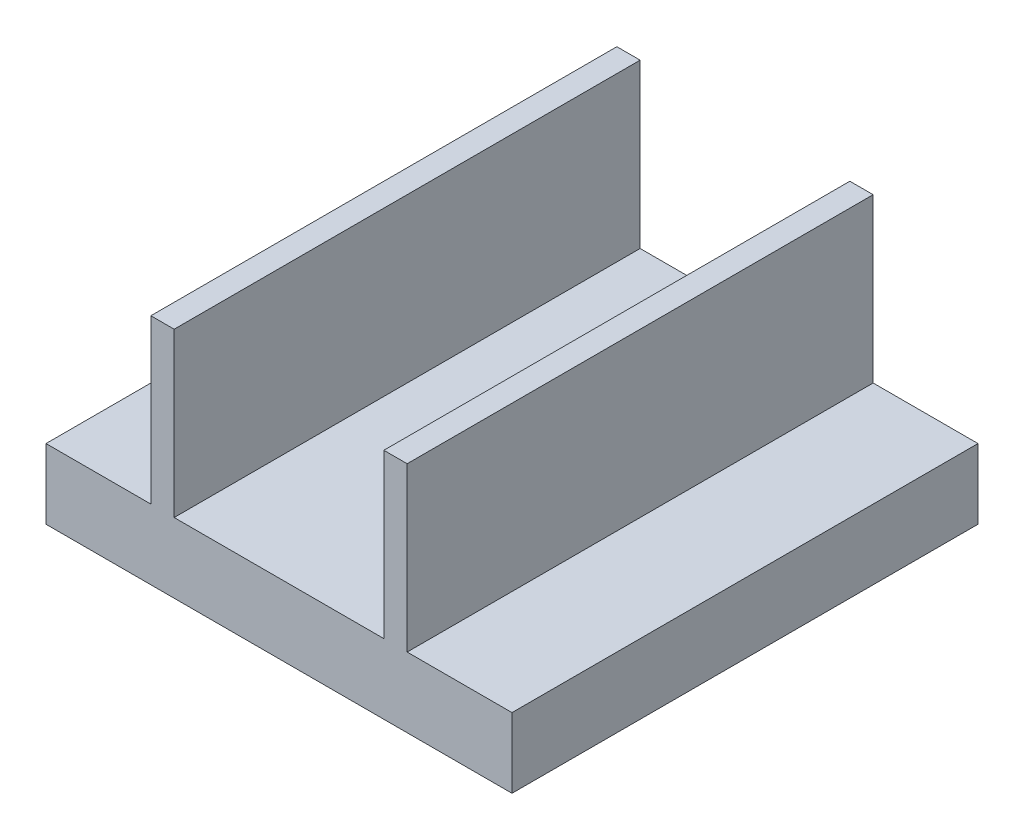
ISO-10303-21;
HEADER;
FILE_DESCRIPTION(('STEP AP214'),'2;1');
FILE_NAME('part.step','',(''),(''),'','','');
FILE_SCHEMA(('AUTOMOTIVE_DESIGN { 1 0 10303 214 1 1 1 1 }'));
ENDSEC;
DATA;
#1=APPLICATION_CONTEXT('core data for automotive mechanical design processes');
#2=APPLICATION_PROTOCOL_DEFINITION('international standard','automotive_design',2000,#1);
#3=PRODUCT_CONTEXT('',#1,'mechanical');
#4=PRODUCT('Part','Part','',(#3));
#5=PRODUCT_RELATED_PRODUCT_CATEGORY('part','',(#4));
#6=PRODUCT_DEFINITION_FORMATION('','',#4);
#7=PRODUCT_DEFINITION_CONTEXT('part definition',#1,'design');
#8=PRODUCT_DEFINITION('design','',#6,#7);
#9=PRODUCT_DEFINITION_SHAPE('','',#8);
#10=(LENGTH_UNIT() NAMED_UNIT(*) SI_UNIT(.MILLI.,.METRE.));
#11=(NAMED_UNIT(*) PLANE_ANGLE_UNIT() SI_UNIT($,.RADIAN.));
#12=(NAMED_UNIT(*) SI_UNIT($,.STERADIAN.) SOLID_ANGLE_UNIT());
#13=UNCERTAINTY_MEASURE_WITH_UNIT(LENGTH_MEASURE(1.E-05),#10,'distance_accuracy_value','');
#14=(GEOMETRIC_REPRESENTATION_CONTEXT(3) GLOBAL_UNCERTAINTY_ASSIGNED_CONTEXT((#13)) GLOBAL_UNIT_ASSIGNED_CONTEXT((#10,
#11,#12)) REPRESENTATION_CONTEXT('',''));
#15=CARTESIAN_POINT('',(0.,0.,0.));
#16=DIRECTION('',(0.,0.,1.));
#17=DIRECTION('',(1.,0.,0.));
#18=AXIS2_PLACEMENT_3D('',#15,#16,#17);
#19=CARTESIAN_POINT('',(0.,0.,20.));
#20=DIRECTION('',(1.,0.,0.));
#21=DIRECTION('',(0.,0.,-1.));
#22=AXIS2_PLACEMENT_3D('',#19,#20,#21);
#23=PLANE('',#22);
#24=DIRECTION('',(0.,-1.,0.));
#25=VECTOR('',#24,1.);
#26=CARTESIAN_POINT('',(0.,0.,0.));
#27=LINE('',#26,#25);
#28=CARTESIAN_POINT('',(0.,3.,0.));
#29=VERTEX_POINT('',#28);
#30=CARTESIAN_POINT('',(0.,0.,0.));
#31=VERTEX_POINT('',#30);
#32=EDGE_CURVE('E163',#29,#31,#27,.T.);
#33=ORIENTED_EDGE('',*,*,#32,.T.);
#34=DIRECTION('',(0.,0.,-1.));
#35=VECTOR('',#34,1.);
#36=CARTESIAN_POINT('',(0.,0.,20.));
#37=LINE('',#36,#35);
#38=CARTESIAN_POINT('',(0.,0.,20.));
#39=VERTEX_POINT('',#38);
#40=EDGE_CURVE('E11',#39,#31,#37,.T.);
#41=ORIENTED_EDGE('',*,*,#40,.F.);
#42=DIRECTION('',(0.,-1.,0.));
#43=VECTOR('',#42,1.);
#44=CARTESIAN_POINT('',(0.,0.,20.));
#45=LINE('',#44,#43);
#46=CARTESIAN_POINT('',(0.,3.,20.));
#47=VERTEX_POINT('',#46);
#48=EDGE_CURVE('E185',#47,#39,#45,.T.);
#49=ORIENTED_EDGE('',*,*,#48,.F.);
#50=DIRECTION('',(0.,0.,-1.));
#51=VECTOR('',#50,1.);
#52=CARTESIAN_POINT('',(0.,3.,20.));
#53=LINE('',#52,#51);
#54=EDGE_CURVE('E159',#47,#29,#53,.T.);
#55=ORIENTED_EDGE('',*,*,#54,.T.);
#56=EDGE_LOOP('',(#33,#41,#49,#55));
#57=FACE_BOUND('',#56,.T.);
#58=ADVANCED_FACE('F43',(#57),#23,.F.);
#59=CARTESIAN_POINT('',(0.,0.,20.));
#60=DIRECTION('',(0.,1.,0.));
#61=DIRECTION('',(0.,0.,1.));
#62=AXIS2_PLACEMENT_3D('',#59,#60,#61);
#63=PLANE('',#62);
#64=DIRECTION('',(1.,0.,0.));
#65=VECTOR('',#64,1.);
#66=CARTESIAN_POINT('',(0.,0.,0.));
#67=LINE('',#66,#65);
#68=CARTESIAN_POINT('',(20.,0.,0.));
#69=VERTEX_POINT('',#68);
#70=EDGE_CURVE('E166',#31,#69,#67,.T.);
#71=ORIENTED_EDGE('',*,*,#70,.T.);
#72=DIRECTION('',(0.,0.,-1.));
#73=VECTOR('',#72,1.);
#74=CARTESIAN_POINT('',(20.,0.,20.));
#75=LINE('',#74,#73);
#76=CARTESIAN_POINT('',(20.,0.,20.));
#77=VERTEX_POINT('',#76);
#78=EDGE_CURVE('E51',#77,#69,#75,.T.);
#79=ORIENTED_EDGE('',*,*,#78,.F.);
#80=DIRECTION('',(1.,0.,0.));
#81=VECTOR('',#80,1.);
#82=CARTESIAN_POINT('',(0.,0.,20.));
#83=LINE('',#82,#81);
#84=EDGE_CURVE('E114',#39,#77,#83,.T.);
#85=ORIENTED_EDGE('',*,*,#84,.F.);
#86=ORIENTED_EDGE('',*,*,#40,.T.);
#87=EDGE_LOOP('',(#71,#79,#85,#86));
#88=FACE_BOUND('',#87,.T.);
#89=ADVANCED_FACE('F263',(#88),#63,.F.);
#90=CARTESIAN_POINT('',(20.,0.,20.));
#91=DIRECTION('',(-1.,0.,0.));
#92=DIRECTION('',(0.,0.,1.));
#93=AXIS2_PLACEMENT_3D('',#90,#91,#92);
#94=PLANE('',#93);
#95=DIRECTION('',(0.,1.,0.));
#96=VECTOR('',#95,1.);
#97=CARTESIAN_POINT('',(20.,0.,0.));
#98=LINE('',#97,#96);
#99=CARTESIAN_POINT('',(20.,3.,0.));
#100=VERTEX_POINT('',#99);
#101=EDGE_CURVE('E168',#69,#100,#98,.T.);
#102=ORIENTED_EDGE('',*,*,#101,.T.);
#103=DIRECTION('',(0.,0.,-1.));
#104=VECTOR('',#103,1.);
#105=CARTESIAN_POINT('',(20.,3.,20.));
#106=LINE('',#105,#104);
#107=CARTESIAN_POINT('',(20.,3.,20.));
#108=VERTEX_POINT('',#107);
#109=EDGE_CURVE('E204',#108,#100,#106,.T.);
#110=ORIENTED_EDGE('',*,*,#109,.F.);
#111=DIRECTION('',(0.,1.,0.));
#112=VECTOR('',#111,1.);
#113=CARTESIAN_POINT('',(20.,0.,20.));
#114=LINE('',#113,#112);
#115=EDGE_CURVE('E212',#77,#108,#114,.T.);
#116=ORIENTED_EDGE('',*,*,#115,.F.);
#117=ORIENTED_EDGE('',*,*,#78,.T.);
#118=EDGE_LOOP('',(#102,#110,#116,#117));
#119=FACE_BOUND('',#118,.T.);
#120=ADVANCED_FACE('F210',(#119),#94,.F.);
#121=CARTESIAN_POINT('',(20.,3.,20.));
#122=DIRECTION('',(0.,-1.,0.));
#123=DIRECTION('',(1.,0.,0.));
#124=AXIS2_PLACEMENT_3D('',#121,#122,#123);
#125=PLANE('',#124);
#126=DIRECTION('',(-1.,0.,0.));
#127=VECTOR('',#126,1.);
#128=CARTESIAN_POINT('',(20.,3.,0.));
#129=LINE('',#128,#127);
#130=CARTESIAN_POINT('',(15.5,3.,0.));
#131=VERTEX_POINT('',#130);
#132=EDGE_CURVE('E170',#100,#131,#129,.T.);
#133=ORIENTED_EDGE('',*,*,#132,.T.);
#134=DIRECTION('',(0.,0.,-1.));
#135=VECTOR('',#134,1.);
#136=CARTESIAN_POINT('',(15.5,3.,20.));
#137=LINE('',#136,#135);
#138=CARTESIAN_POINT('',(15.5,3.,20.));
#139=VERTEX_POINT('',#138);
#140=EDGE_CURVE('E201',#139,#131,#137,.T.);
#141=ORIENTED_EDGE('',*,*,#140,.F.);
#142=DIRECTION('',(-1.,0.,0.));
#143=VECTOR('',#142,1.);
#144=CARTESIAN_POINT('',(20.,3.,20.));
#145=LINE('',#144,#143);
#146=EDGE_CURVE('E230',#108,#139,#145,.T.);
#147=ORIENTED_EDGE('',*,*,#146,.F.);
#148=ORIENTED_EDGE('',*,*,#109,.T.);
#149=EDGE_LOOP('',(#133,#141,#147,#148));
#150=FACE_BOUND('',#149,.T.);
#151=ADVANCED_FACE('F221',(#150),#125,.F.);
#152=CARTESIAN_POINT('',(15.5,3.,20.));
#153=DIRECTION('',(-1.,0.,0.));
#154=DIRECTION('',(0.,0.,1.));
#155=AXIS2_PLACEMENT_3D('',#152,#153,#154);
#156=PLANE('',#155);
#157=DIRECTION('',(0.,1.,0.));
#158=VECTOR('',#157,1.);
#159=CARTESIAN_POINT('',(15.5,3.,0.));
#160=LINE('',#159,#158);
#161=CARTESIAN_POINT('',(15.5,10.,0.));
#162=VERTEX_POINT('',#161);
#163=EDGE_CURVE('E172',#131,#162,#160,.T.);
#164=ORIENTED_EDGE('',*,*,#163,.T.);
#165=DIRECTION('',(0.,0.,-1.));
#166=VECTOR('',#165,1.);
#167=CARTESIAN_POINT('',(15.5,10.,20.));
#168=LINE('',#167,#166);
#169=CARTESIAN_POINT('',(15.5,10.,20.));
#170=VERTEX_POINT('',#169);
#171=EDGE_CURVE('E198',#170,#162,#168,.T.);
#172=ORIENTED_EDGE('',*,*,#171,.F.);
#173=DIRECTION('',(0.,1.,0.));
#174=VECTOR('',#173,1.);
#175=CARTESIAN_POINT('',(15.5,3.,20.));
#176=LINE('',#175,#174);
#177=EDGE_CURVE('E227',#139,#170,#176,.T.);
#178=ORIENTED_EDGE('',*,*,#177,.F.);
#179=ORIENTED_EDGE('',*,*,#140,.T.);
#180=EDGE_LOOP('',(#164,#172,#178,#179));
#181=FACE_BOUND('',#180,.T.);
#182=ADVANCED_FACE('F225',(#181),#156,.F.);
#183=CARTESIAN_POINT('',(15.5,10.,20.));
#184=DIRECTION('',(0.,-1.,0.));
#185=DIRECTION('',(0.,0.,-1.));
#186=AXIS2_PLACEMENT_3D('',#183,#184,#185);
#187=PLANE('',#186);
#188=DIRECTION('',(-1.,0.,0.));
#189=VECTOR('',#188,1.);
#190=CARTESIAN_POINT('',(15.5,10.,0.));
#191=LINE('',#190,#189);
#192=CARTESIAN_POINT('',(14.5,10.,0.));
#193=VERTEX_POINT('',#192);
#194=EDGE_CURVE('E174',#162,#193,#191,.T.);
#195=ORIENTED_EDGE('',*,*,#194,.T.);
#196=DIRECTION('',(0.,0.,-1.));
#197=VECTOR('',#196,1.);
#198=CARTESIAN_POINT('',(14.5,10.,20.));
#199=LINE('',#198,#197);
#200=CARTESIAN_POINT('',(14.5,10.,20.));
#201=VERTEX_POINT('',#200);
#202=EDGE_CURVE('E195',#201,#193,#199,.T.);
#203=ORIENTED_EDGE('',*,*,#202,.F.);
#204=DIRECTION('',(-1.,0.,0.));
#205=VECTOR('',#204,1.);
#206=CARTESIAN_POINT('',(15.5,10.,20.));
#207=LINE('',#206,#205);
#208=EDGE_CURVE('E229',#170,#201,#207,.T.);
#209=ORIENTED_EDGE('',*,*,#208,.F.);
#210=ORIENTED_EDGE('',*,*,#171,.T.);
#211=EDGE_LOOP('',(#195,#203,#209,#210));
#212=FACE_BOUND('',#211,.T.);
#213=ADVANCED_FACE('F276',(#212),#187,.F.);
#214=CARTESIAN_POINT('',(14.5,10.,20.));
#215=DIRECTION('',(1.,0.,0.));
#216=DIRECTION('',(0.,0.,-1.));
#217=AXIS2_PLACEMENT_3D('',#214,#215,#216);
#218=PLANE('',#217);
#219=DIRECTION('',(0.,-1.,0.));
#220=VECTOR('',#219,1.);
#221=CARTESIAN_POINT('',(14.5,10.,0.));
#222=LINE('',#221,#220);
#223=CARTESIAN_POINT('',(14.5,3.,0.));
#224=VERTEX_POINT('',#223);
#225=EDGE_CURVE('E176',#193,#224,#222,.T.);
#226=ORIENTED_EDGE('',*,*,#225,.T.);
#227=DIRECTION('',(0.,0.,-1.));
#228=VECTOR('',#227,1.);
#229=CARTESIAN_POINT('',(14.5,3.,20.));
#230=LINE('',#229,#228);
#231=CARTESIAN_POINT('',(14.5,3.,20.));
#232=VERTEX_POINT('',#231);
#233=EDGE_CURVE('E192',#232,#224,#230,.T.);
#234=ORIENTED_EDGE('',*,*,#233,.F.);
#235=DIRECTION('',(0.,-1.,0.));
#236=VECTOR('',#235,1.);
#237=CARTESIAN_POINT('',(14.5,10.,20.));
#238=LINE('',#237,#236);
#239=EDGE_CURVE('E232',#201,#232,#238,.T.);
#240=ORIENTED_EDGE('',*,*,#239,.F.);
#241=ORIENTED_EDGE('',*,*,#202,.T.);
#242=EDGE_LOOP('',(#226,#234,#240,#241));
#243=FACE_BOUND('',#242,.T.);
#244=ADVANCED_FACE('F279',(#243),#218,.F.);
#245=CARTESIAN_POINT('',(5.5,3.,20.));
#246=DIRECTION('',(0.,-1.,0.));
#247=DIRECTION('',(1.,0.,0.));
#248=AXIS2_PLACEMENT_3D('',#245,#246,#247);
#249=PLANE('',#248);
#250=DIRECTION('',(-1.,0.,0.));
#251=VECTOR('',#250,1.);
#252=CARTESIAN_POINT('',(5.5,3.,0.));
#253=LINE('',#252,#251);
#254=CARTESIAN_POINT('',(5.5,3.,0.));
#255=VERTEX_POINT('',#254);
#256=EDGE_CURVE('E178',#224,#255,#253,.T.);
#257=ORIENTED_EDGE('',*,*,#256,.T.);
#258=DIRECTION('',(0.,0.,-1.));
#259=VECTOR('',#258,1.);
#260=CARTESIAN_POINT('',(5.5,3.,20.));
#261=LINE('',#260,#259);
#262=CARTESIAN_POINT('',(5.5,3.,20.));
#263=VERTEX_POINT('',#262);
#264=EDGE_CURVE('E189',#263,#255,#261,.T.);
#265=ORIENTED_EDGE('',*,*,#264,.F.);
#266=DIRECTION('',(-1.,0.,0.));
#267=VECTOR('',#266,1.);
#268=CARTESIAN_POINT('',(5.5,3.,20.));
#269=LINE('',#268,#267);
#270=EDGE_CURVE('E238',#232,#263,#269,.T.);
#271=ORIENTED_EDGE('',*,*,#270,.F.);
#272=ORIENTED_EDGE('',*,*,#233,.T.);
#273=EDGE_LOOP('',(#257,#265,#271,#272));
#274=FACE_BOUND('',#273,.T.);
#275=ADVANCED_FACE('F244',(#274),#249,.F.);
#276=CARTESIAN_POINT('',(5.5,10.,20.));
#277=DIRECTION('',(-1.,0.,0.));
#278=DIRECTION('',(0.,0.,1.));
#279=AXIS2_PLACEMENT_3D('',#276,#277,#278);
#280=PLANE('',#279);
#281=DIRECTION('',(0.,1.,0.));
#282=VECTOR('',#281,1.);
#283=CARTESIAN_POINT('',(5.5,10.,0.));
#284=LINE('',#283,#282);
#285=CARTESIAN_POINT('',(5.5,10.,0.));
#286=VERTEX_POINT('',#285);
#287=EDGE_CURVE('E180',#255,#286,#284,.T.);
#288=ORIENTED_EDGE('',*,*,#287,.T.);
#289=DIRECTION('',(0.,0.,-1.));
#290=VECTOR('',#289,1.);
#291=CARTESIAN_POINT('',(5.5,10.,20.));
#292=LINE('',#291,#290);
#293=CARTESIAN_POINT('',(5.5,10.,20.));
#294=VERTEX_POINT('',#293);
#295=EDGE_CURVE('E154',#294,#286,#292,.T.);
#296=ORIENTED_EDGE('',*,*,#295,.F.);
#297=DIRECTION('',(0.,1.,0.));
#298=VECTOR('',#297,1.);
#299=CARTESIAN_POINT('',(5.5,10.,20.));
#300=LINE('',#299,#298);
#301=EDGE_CURVE('E145',#263,#294,#300,.T.);
#302=ORIENTED_EDGE('',*,*,#301,.F.);
#303=ORIENTED_EDGE('',*,*,#264,.T.);
#304=EDGE_LOOP('',(#288,#296,#302,#303));
#305=FACE_BOUND('',#304,.T.);
#306=ADVANCED_FACE('F248',(#305),#280,.F.);
#307=CARTESIAN_POINT('',(4.5,10.,20.));
#308=DIRECTION('',(0.,-1.,0.));
#309=DIRECTION('',(0.,0.,-1.));
#310=AXIS2_PLACEMENT_3D('',#307,#308,#309);
#311=PLANE('',#310);
#312=DIRECTION('',(-1.,0.,0.));
#313=VECTOR('',#312,1.);
#314=CARTESIAN_POINT('',(4.5,10.,0.));
#315=LINE('',#314,#313);
#316=CARTESIAN_POINT('',(4.5,10.,0.));
#317=VERTEX_POINT('',#316);
#318=EDGE_CURVE('E153',#286,#317,#315,.T.);
#319=ORIENTED_EDGE('',*,*,#318,.T.);
#320=DIRECTION('',(0.,0.,-1.));
#321=VECTOR('',#320,1.);
#322=CARTESIAN_POINT('',(4.5,10.,20.));
#323=LINE('',#322,#321);
#324=CARTESIAN_POINT('',(4.5,10.,20.));
#325=VERTEX_POINT('',#324);
#326=EDGE_CURVE('E150',#325,#317,#323,.T.);
#327=ORIENTED_EDGE('',*,*,#326,.F.);
#328=DIRECTION('',(-1.,0.,0.));
#329=VECTOR('',#328,1.);
#330=CARTESIAN_POINT('',(4.5,10.,20.));
#331=LINE('',#330,#329);
#332=EDGE_CURVE('E139',#294,#325,#331,.T.);
#333=ORIENTED_EDGE('',*,*,#332,.F.);
#334=ORIENTED_EDGE('',*,*,#295,.T.);
#335=EDGE_LOOP('',(#319,#327,#333,#334));
#336=FACE_BOUND('',#335,.T.);
#337=ADVANCED_FACE('F151',(#336),#311,.F.);
#338=CARTESIAN_POINT('',(4.5,3.,20.));
#339=DIRECTION('',(1.,0.,0.));
#340=DIRECTION('',(0.,0.,-1.));
#341=AXIS2_PLACEMENT_3D('',#338,#339,#340);
#342=PLANE('',#341);
#343=DIRECTION('',(0.,-1.,0.));
#344=VECTOR('',#343,1.);
#345=CARTESIAN_POINT('',(4.5,3.,0.));
#346=LINE('',#345,#344);
#347=CARTESIAN_POINT('',(4.5,3.,0.));
#348=VERTEX_POINT('',#347);
#349=EDGE_CURVE('E100',#317,#348,#346,.T.);
#350=ORIENTED_EDGE('',*,*,#349,.T.);
#351=DIRECTION('',(0.,0.,-1.));
#352=VECTOR('',#351,1.);
#353=CARTESIAN_POINT('',(4.5,3.,20.));
#354=LINE('',#353,#352);
#355=CARTESIAN_POINT('',(4.5,3.,20.));
#356=VERTEX_POINT('',#355);
#357=EDGE_CURVE('E155',#356,#348,#354,.T.);
#358=ORIENTED_EDGE('',*,*,#357,.F.);
#359=DIRECTION('',(0.,-1.,0.));
#360=VECTOR('',#359,1.);
#361=CARTESIAN_POINT('',(4.5,3.,20.));
#362=LINE('',#361,#360);
#363=EDGE_CURVE('E143',#325,#356,#362,.T.);
#364=ORIENTED_EDGE('',*,*,#363,.F.);
#365=ORIENTED_EDGE('',*,*,#326,.T.);
#366=EDGE_LOOP('',(#350,#358,#364,#365));
#367=FACE_BOUND('',#366,.T.);
#368=ADVANCED_FACE('F157',(#367),#342,.F.);
#369=CARTESIAN_POINT('',(0.,3.,20.));
#370=DIRECTION('',(0.,-1.,0.));
#371=DIRECTION('',(0.,0.,-1.));
#372=AXIS2_PLACEMENT_3D('',#369,#370,#371);
#373=PLANE('',#372);
#374=DIRECTION('',(-1.,0.,0.));
#375=VECTOR('',#374,1.);
#376=CARTESIAN_POINT('',(0.,3.,0.));
#377=LINE('',#376,#375);
#378=EDGE_CURVE('E106',#348,#29,#377,.T.);
#379=ORIENTED_EDGE('',*,*,#378,.T.);
#380=ORIENTED_EDGE('',*,*,#54,.F.);
#381=DIRECTION('',(-1.,0.,0.));
#382=VECTOR('',#381,1.);
#383=CARTESIAN_POINT('',(0.,3.,20.));
#384=LINE('',#383,#382);
#385=EDGE_CURVE('E59',#356,#47,#384,.T.);
#386=ORIENTED_EDGE('',*,*,#385,.F.);
#387=ORIENTED_EDGE('',*,*,#357,.T.);
#388=EDGE_LOOP('',(#379,#380,#386,#387));
#389=FACE_BOUND('',#388,.T.);
#390=ADVANCED_FACE('F252',(#389),#373,.F.);
#391=CARTESIAN_POINT('',(0.,0.,20.));
#392=DIRECTION('',(0.,0.,-1.));
#393=DIRECTION('',(-1.,0.,0.));
#394=AXIS2_PLACEMENT_3D('',#391,#392,#393);
#395=PLANE('',#394);
#396=ORIENTED_EDGE('',*,*,#48,.T.);
#397=ORIENTED_EDGE('',*,*,#84,.T.);
#398=ORIENTED_EDGE('',*,*,#115,.T.);
#399=ORIENTED_EDGE('',*,*,#146,.T.);
#400=ORIENTED_EDGE('',*,*,#177,.T.);
#401=ORIENTED_EDGE('',*,*,#208,.T.);
#402=ORIENTED_EDGE('',*,*,#239,.T.);
#403=ORIENTED_EDGE('',*,*,#270,.T.);
#404=ORIENTED_EDGE('',*,*,#301,.T.);
#405=ORIENTED_EDGE('',*,*,#332,.T.);
#406=ORIENTED_EDGE('',*,*,#363,.T.);
#407=ORIENTED_EDGE('',*,*,#385,.T.);
#408=EDGE_LOOP('',(#396,#397,#398,#399,#400,#401,#402,#403,#404,#405,#406,#407));
#409=FACE_BOUND('',#408,.T.);
#410=ADVANCED_FACE('F141',(#409),#395,.F.);
#411=CARTESIAN_POINT('',(0.,0.,0.));
#412=DIRECTION('',(0.,0.,-1.));
#413=DIRECTION('',(-1.,0.,0.));
#414=AXIS2_PLACEMENT_3D('',#411,#412,#413);
#415=PLANE('',#414);
#416=ORIENTED_EDGE('',*,*,#32,.F.);
#417=ORIENTED_EDGE('',*,*,#378,.F.);
#418=ORIENTED_EDGE('',*,*,#349,.F.);
#419=ORIENTED_EDGE('',*,*,#318,.F.);
#420=ORIENTED_EDGE('',*,*,#287,.F.);
#421=ORIENTED_EDGE('',*,*,#256,.F.);
#422=ORIENTED_EDGE('',*,*,#225,.F.);
#423=ORIENTED_EDGE('',*,*,#194,.F.);
#424=ORIENTED_EDGE('',*,*,#163,.F.);
#425=ORIENTED_EDGE('',*,*,#132,.F.);
#426=ORIENTED_EDGE('',*,*,#101,.F.);
#427=ORIENTED_EDGE('',*,*,#70,.F.);
#428=EDGE_LOOP('',(#416,#417,#418,#419,#420,#421,#422,#423,#424,#425,#426,#427));
#429=FACE_BOUND('',#428,.T.);
#430=ADVANCED_FACE('F216',(#429),#415,.T.);
#431=CLOSED_SHELL('',(#58,#89,#120,#151,#182,#213,#244,#275,#306,#337,#368,#390,#410,#430));
#432=MANIFOLD_SOLID_BREP('B2',#431);
#433=ADVANCED_BREP_SHAPE_REPRESENTATION('',(#18,#432),#14);
#434=SHAPE_DEFINITION_REPRESENTATION(#9,#433);
ENDSEC;
END-ISO-10303-21;
